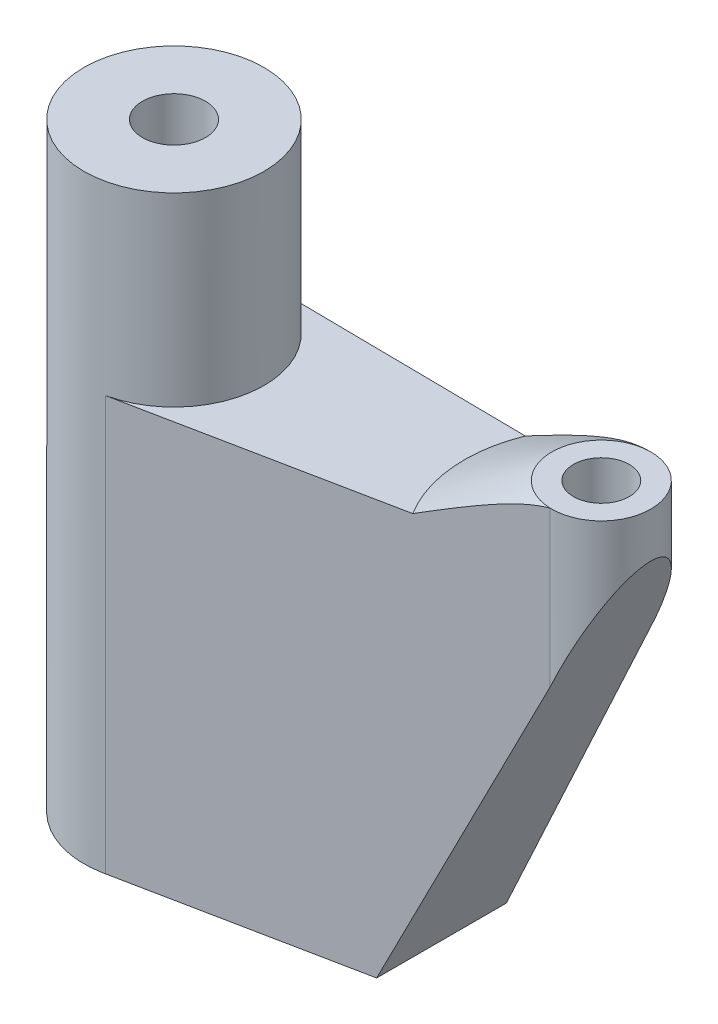
ISO-10303-21;
HEADER;
FILE_DESCRIPTION(('STEP AP214'),'2;1');
FILE_NAME('part.step','',(''),(''),'','','');
FILE_SCHEMA(('AUTOMOTIVE_DESIGN { 1 0 10303 214 1 1 1 1 }'));
ENDSEC;
DATA;
#1=APPLICATION_CONTEXT('core data for automotive mechanical design processes');
#2=APPLICATION_PROTOCOL_DEFINITION('international standard','automotive_design',2000,#1);
#3=PRODUCT_CONTEXT('',#1,'mechanical');
#4=PRODUCT('Part','Part','',(#3));
#5=PRODUCT_RELATED_PRODUCT_CATEGORY('part','',(#4));
#6=PRODUCT_DEFINITION_FORMATION('','',#4);
#7=PRODUCT_DEFINITION_CONTEXT('part definition',#1,'design');
#8=PRODUCT_DEFINITION('design','',#6,#7);
#9=PRODUCT_DEFINITION_SHAPE('','',#8);
#10=(LENGTH_UNIT() NAMED_UNIT(*) SI_UNIT(.MILLI.,.METRE.));
#11=(NAMED_UNIT(*) PLANE_ANGLE_UNIT() SI_UNIT($,.RADIAN.));
#12=(NAMED_UNIT(*) SI_UNIT($,.STERADIAN.) SOLID_ANGLE_UNIT());
#13=UNCERTAINTY_MEASURE_WITH_UNIT(LENGTH_MEASURE(1.E-05),#10,'distance_accuracy_value','');
#14=(GEOMETRIC_REPRESENTATION_CONTEXT(3) GLOBAL_UNCERTAINTY_ASSIGNED_CONTEXT((#13)) GLOBAL_UNIT_ASSIGNED_CONTEXT((#10,
#11,#12)) REPRESENTATION_CONTEXT('',''));
#15=CARTESIAN_POINT('',(0.,0.,0.));
#16=DIRECTION('',(0.,0.,1.));
#17=DIRECTION('',(1.,0.,0.));
#18=AXIS2_PLACEMENT_3D('',#15,#16,#17);
#19=CARTESIAN_POINT('',(0.,0.,0.));
#20=DIRECTION('',(0.,1.,0.));
#21=DIRECTION('',(0.,0.,1.));
#22=AXIS2_PLACEMENT_3D('',#19,#20,#21);
#23=PLANE('',#22);
#24=DIRECTION('',(0.999932354565805,0.,0.0116312635808046));
#25=VECTOR('',#24,1.);
#26=CARTESIAN_POINT('',(21.6378168834572,0.,-4.74845452445996));
#27=LINE('',#26,#25);
#28=CARTESIAN_POINT('',(0.101915459285161,0.,-4.99896121600865));
#29=VERTEX_POINT('',#28);
#30=CARTESIAN_POINT('',(13.6150315649885,0.,-4.84177596792084));
#31=VERTEX_POINT('',#30);
#32=EDGE_CURVE('E160',#29,#31,#27,.T.);
#33=ORIENTED_EDGE('',*,*,#32,.T.);
#34=DIRECTION('',(0.,0.,1.));
#35=VECTOR('',#34,1.);
#36=CARTESIAN_POINT('',(13.6150315649885,0.,0.));
#37=LINE('',#36,#35);
#38=CARTESIAN_POINT('',(13.6150315649885,0.,2.36158122583261));
#39=VERTEX_POINT('',#38);
#40=EDGE_CURVE('E241',#31,#39,#37,.T.);
#41=ORIENTED_EDGE('',*,*,#40,.T.);
#42=DIRECTION('',(-0.980378773363854,0.,0.197122958423379));
#43=VECTOR('',#42,1.);
#44=CARTESIAN_POINT('',(21.6378168834572,0.,0.748454524459963));
#45=LINE('',#44,#43);
#46=CARTESIAN_POINT('',(1.07949394707919,0.,4.88207873945304));
#47=VERTEX_POINT('',#46);
#48=EDGE_CURVE('E116',#39,#47,#45,.T.);
#49=ORIENTED_EDGE('',*,*,#48,.T.);
#50=CARTESIAN_POINT('',(0.,0.,0.));
#51=DIRECTION('',(0.,1.,0.));
#52=DIRECTION('',(0.178274539385162,0.,0.983980786706229));
#53=AXIS2_PLACEMENT_3D('',#50,#51,#52);
#54=CIRCLE('',#53,5.);
#55=CARTESIAN_POINT('',(0.891372696925809,0.,4.91990393353114));
#56=VERTEX_POINT('',#55);
#57=EDGE_CURVE('E138',#56,#47,#54,.T.);
#58=ORIENTED_EDGE('',*,*,#57,.F.);
#59=CARTESIAN_POINT('',(0.,0.,0.));
#60=DIRECTION('',(0.,1.,0.));
#61=DIRECTION('',(0.,0.,1.));
#62=AXIS2_PLACEMENT_3D('',#59,#60,#61);
#63=CIRCLE('',#62,5.);
#64=CARTESIAN_POINT('',(0.0143927209272228,0.,-4.99997928491552));
#65=VERTEX_POINT('',#64);
#66=EDGE_CURVE('E219',#65,#56,#63,.T.);
#67=ORIENTED_EDGE('',*,*,#66,.F.);
#68=CARTESIAN_POINT('',(0.,0.,0.));
#69=DIRECTION('',(0.,1.,0.));
#70=DIRECTION('',(0.020383091857032,0.,-0.99979224320173));
#71=AXIS2_PLACEMENT_3D('',#68,#69,#70);
#72=CIRCLE('',#71,5.);
#73=EDGE_CURVE('E111',#29,#65,#72,.T.);
#74=ORIENTED_EDGE('',*,*,#73,.F.);
#75=EDGE_LOOP('',(#33,#41,#49,#58,#67,#74));
#76=FACE_BOUND('',#75,.T.);
#77=CARTESIAN_POINT('',(0.,0.,0.));
#78=DIRECTION('',(0.,1.,0.));
#79=DIRECTION('',(0.,0.,1.));
#80=AXIS2_PLACEMENT_3D('',#77,#78,#79);
#81=CIRCLE('',#80,1.75);
#82=CARTESIAN_POINT('',(0.,0.,1.75));
#83=VERTEX_POINT('',#82);
#84=EDGE_CURVE('E124',#83,#83,#81,.T.);
#85=ORIENTED_EDGE('',*,*,#84,.T.);
#86=EDGE_LOOP('',(#85));
#87=FACE_BOUND('',#86,.T.);
#88=ADVANCED_FACE('F39',(#76,#87),#23,.F.);
#89=CARTESIAN_POINT('',(0.,33.3,0.));
#90=DIRECTION('',(0.,1.,0.));
#91=DIRECTION('',(0.,0.,1.));
#92=AXIS2_PLACEMENT_3D('',#89,#90,#91);
#93=PLANE('',#92);
#94=CARTESIAN_POINT('',(0.,33.3,0.));
#95=DIRECTION('',(0.,1.,0.));
#96=DIRECTION('',(0.,0.,1.));
#97=AXIS2_PLACEMENT_3D('',#94,#95,#96);
#98=CIRCLE('',#97,5.);
#99=CARTESIAN_POINT('',(0.,33.3,5.));
#100=VERTEX_POINT('',#99);
#101=EDGE_CURVE('E144',#100,#100,#98,.T.);
#102=ORIENTED_EDGE('',*,*,#101,.T.);
#103=EDGE_LOOP('',(#102));
#104=FACE_BOUND('',#103,.T.);
#105=CARTESIAN_POINT('',(0.,33.3,0.));
#106=DIRECTION('',(0.,1.,0.));
#107=DIRECTION('',(0.,0.,1.));
#108=AXIS2_PLACEMENT_3D('',#105,#106,#107);
#109=CIRCLE('',#108,1.75);
#110=CARTESIAN_POINT('',(0.,33.3,1.75));
#111=VERTEX_POINT('',#110);
#112=EDGE_CURVE('E248',#111,#111,#109,.T.);
#113=ORIENTED_EDGE('',*,*,#112,.F.);
#114=EDGE_LOOP('',(#113));
#115=FACE_BOUND('',#114,.T.);
#116=ADVANCED_FACE('F182',(#104,#115),#93,.T.);
#117=CARTESIAN_POINT('',(0.,33.3,0.));
#118=DIRECTION('',(0.,-1.,0.));
#119=DIRECTION('',(0.,0.,-1.));
#120=AXIS2_PLACEMENT_3D('',#117,#118,#119);
#121=CYLINDRICAL_SURFACE('',#120,5.);
#122=CARTESIAN_POINT('',(0.,23.,0.));
#123=DIRECTION('',(0.,1.,0.));
#124=DIRECTION('',(0.,0.,1.));
#125=AXIS2_PLACEMENT_3D('',#122,#123,#124);
#126=CIRCLE('',#125,5.);
#127=CARTESIAN_POINT('',(1.07949394707918,23.,4.88207873945304));
#128=VERTEX_POINT('',#127);
#129=CARTESIAN_POINT('',(0.101915459285161,23.,-4.99896121600865));
#130=VERTEX_POINT('',#129);
#131=EDGE_CURVE('E142',#128,#130,#126,.T.);
#132=ORIENTED_EDGE('',*,*,#131,.T.);
#133=DIRECTION('',(0.,-1.,0.));
#134=VECTOR('',#133,1.);
#135=CARTESIAN_POINT('',(0.101915459285238,33.3,-4.99896121600865));
#136=LINE('',#135,#134);
#137=EDGE_CURVE('E135',#130,#29,#136,.T.);
#138=ORIENTED_EDGE('',*,*,#137,.T.);
#139=ORIENTED_EDGE('',*,*,#73,.T.);
#140=ORIENTED_EDGE('',*,*,#66,.T.);
#141=ORIENTED_EDGE('',*,*,#57,.T.);
#142=DIRECTION('',(0.,-1.,0.));
#143=VECTOR('',#142,1.);
#144=CARTESIAN_POINT('',(1.07949394707924,33.3,4.88207873945303));
#145=LINE('',#144,#143);
#146=EDGE_CURVE('E139',#47,#128,#145,.F.);
#147=ORIENTED_EDGE('',*,*,#146,.T.);
#148=EDGE_LOOP('',(#132,#138,#139,#140,#141,#147));
#149=FACE_BOUND('',#148,.T.);
#150=ORIENTED_EDGE('',*,*,#101,.F.);
#151=EDGE_LOOP('',(#150));
#152=FACE_BOUND('',#151,.T.);
#153=ADVANCED_FACE('F180',(#149,#152),#121,.T.);
#154=CARTESIAN_POINT('',(0.,33.3,0.));
#155=DIRECTION('',(0.,-1.,0.));
#156=DIRECTION('',(0.,0.,-1.));
#157=AXIS2_PLACEMENT_3D('',#154,#155,#156);
#158=CYLINDRICAL_SURFACE('',#157,1.75);
#159=ORIENTED_EDGE('',*,*,#112,.T.);
#160=EDGE_LOOP('',(#159));
#161=FACE_BOUND('',#160,.T.);
#162=ORIENTED_EDGE('',*,*,#84,.F.);
#163=EDGE_LOOP('',(#162));
#164=FACE_BOUND('',#163,.T.);
#165=ADVANCED_FACE('F171',(#161,#164),#158,.F.);
#166=CARTESIAN_POINT('',(21.6378168834572,23.,-4.74845452445996));
#167=DIRECTION('',(0.0116312635808046,0.,-0.999932354565804));
#168=DIRECTION('',(-0.999932354565805,0.,-0.0116312635808046));
#169=AXIS2_PLACEMENT_3D('',#166,#167,#168);
#170=PLANE('',#169);
#171=DIRECTION('',(0.422613155286226,0.90629683620969,0.00491585753716713));
#172=VECTOR('',#171,1.);
#173=CARTESIAN_POINT('',(23.8574081819732,21.964847537589,-4.72263612652852));
#174=LINE('',#173,#172);
#175=CARTESIAN_POINT('',(21.6378168834572,17.2049186372185,-4.74845452445996));
#176=VERTEX_POINT('',#175);
#177=EDGE_CURVE('E109',#31,#176,#174,.T.);
#178=ORIENTED_EDGE('',*,*,#177,.F.);
#179=ORIENTED_EDGE('',*,*,#32,.F.);
#180=ORIENTED_EDGE('',*,*,#137,.F.);
#181=DIRECTION('',(0.999932354565805,0.,0.0116312635808046));
#182=VECTOR('',#181,1.);
#183=CARTESIAN_POINT('',(21.6378168834572,23.,-4.74845452445996));
#184=LINE('',#183,#182);
#185=CARTESIAN_POINT('',(14.6766021532962,23.,-4.82942772529637));
#186=VERTEX_POINT('',#185);
#187=EDGE_CURVE('E122',#130,#186,#184,.T.);
#188=ORIENTED_EDGE('',*,*,#187,.T.);
#189=CARTESIAN_POINT('',(14.6766021532962,23.,-4.82942772529637));
#190=CARTESIAN_POINT('',(14.8796626698256,23.1092941178577,-4.82706571512656));
#191=CARTESIAN_POINT('',(15.0829635424872,23.2181464252805,-4.8247009091221));
#192=CARTESIAN_POINT('',(15.4902340555521,23.4346386005559,-4.81996351797307));
#193=CARTESIAN_POINT('',(15.6942037576039,23.5422783523416,-4.81759093211141));
#194=CARTESIAN_POINT('',(16.1036749014754,23.7563687196145,-4.81282794311385));
#195=CARTESIAN_POINT('',(16.3091792047588,23.8628138728167,-4.81043750669326));
#196=CARTESIAN_POINT('',(16.7212525461933,24.0736002972985,-4.8056442488024));
#197=CARTESIAN_POINT('',(16.9278215277995,24.1779416788922,-4.80324142798986));
#198=CARTESIAN_POINT('',(17.3376459041992,24.3814130630635,-4.79847433017372));
#199=CARTESIAN_POINT('',(17.5408690963755,24.480607671266,-4.79611042775258));
#200=CARTESIAN_POINT('',(17.9491239391777,24.6751849384902,-4.7913615868304));
#201=CARTESIAN_POINT('',(18.1541554850912,24.7705678164839,-4.78897664954738));
#202=CARTESIAN_POINT('',(18.5665029122763,24.955805858541,-4.78418020347724));
#203=CARTESIAN_POINT('',(18.7738164815264,25.0456661014631,-4.78176872158368));
#204=CARTESIAN_POINT('',(19.0872597302892,25.1743670145884,-4.77812273390527));
#205=CARTESIAN_POINT('',(19.1921400639008,25.2162476897179,-4.77690276057497));
#206=CARTESIAN_POINT('',(19.4028651374469,25.2975003427465,-4.77445159589137));
#207=CARTESIAN_POINT('',(19.5087098034331,25.3368725111864,-4.77322040539825));
#208=CARTESIAN_POINT('',(19.6962421242857,25.4035469087023,-4.77103901998373));
#209=CARTESIAN_POINT('',(19.777699608178,25.4314956328406,-4.77009150242271));
#210=CARTESIAN_POINT('',(19.9413120433655,25.4852809285915,-4.76818835432467));
#211=CARTESIAN_POINT('',(20.0234669932341,25.5111175045231,-4.76723272380424));
#212=CARTESIAN_POINT('',(20.1884133671109,25.5602861589062,-4.76531405926408));
#213=CARTESIAN_POINT('',(20.2712038529606,25.5836213686864,-4.76435103615707));
#214=CARTESIAN_POINT('',(20.4375486183177,25.6274202653575,-4.76241610545668));
#215=CARTESIAN_POINT('',(20.5211029231418,25.6478838566983,-4.76144419756883));
#216=CARTESIAN_POINT('',(20.68964824343,25.6856553270922,-4.75948366990251));
#217=CARTESIAN_POINT('',(20.7746454223341,25.7029359211913,-4.75849497843058));
#218=CARTESIAN_POINT('',(20.9453202419842,25.7336786011953,-4.75650968032027));
#219=CARTESIAN_POINT('',(21.0309977786458,25.7471412600418,-4.7555130748926));
#220=CARTESIAN_POINT('',(21.2033086153485,25.7698783355715,-4.75350874654942));
#221=CARTESIAN_POINT('',(21.2899444858131,25.7791335273032,-4.75250099373462));
#222=CARTESIAN_POINT('',(21.4636328266449,25.7930737488483,-4.75048064219393));
#223=CARTESIAN_POINT('',(21.5506855153192,25.7977560400299,-4.74946804092869));
#224=CARTESIAN_POINT('',(21.6378168834572,25.8,-4.74845452445996));
#225=B_SPLINE_CURVE_WITH_KNOTS('',3,(#189,#190,#191,#192,#193,#194,#195,#196,#197,#198,#199,
#200,#201,#202,#203,#204,#205,#206,#207,#208,#209,#210,#211,#212,#213,#214,#215,#216,#217,#218,
#219,#220,#221,#222,#223,#224),.UNSPECIFIED.,.F.,.F.,(4,2,2,2,2,2,2,2,2,2,2,2,2,2,2,2,2,4),(0.,
0.691854884624876,1.38377544090352,2.07811120512196,2.77241046571636,3.45083776481357,
4.12922603421089,4.80698079272842,5.14577582069325,5.48454508372705,5.74289349267163,
6.00124137332267,6.25926196897584,6.51729114795656,6.77743854151787,7.03754687517051,
7.29883204812334,7.56027360451283),.UNSPECIFIED.);
#226=CARTESIAN_POINT('',(21.6378168834572,25.8,-4.74845452445996));
#227=VERTEX_POINT('',#226);
#228=EDGE_CURVE('E54',#186,#227,#225,.T.);
#229=ORIENTED_EDGE('',*,*,#228,.T.);
#230=DIRECTION('',(0.,-1.,0.));
#231=VECTOR('',#230,1.);
#232=CARTESIAN_POINT('',(21.6378168834572,23.,-4.74845452445996));
#233=LINE('',#232,#231);
#234=EDGE_CURVE('E67',#227,#176,#233,.T.);
#235=ORIENTED_EDGE('',*,*,#234,.T.);
#236=EDGE_LOOP('',(#178,#179,#180,#188,#229,#235));
#237=FACE_BOUND('',#236,.T.);
#238=ADVANCED_FACE('F167',(#237),#170,.T.);
#239=CARTESIAN_POINT('',(21.6378168834572,23.,0.748454524459963));
#240=DIRECTION('',(0.197122958423379,0.,0.980378773363854));
#241=DIRECTION('',(0.980378773363854,0.,-0.197122958423379));
#242=AXIS2_PLACEMENT_3D('',#239,#240,#241);
#243=PLANE('',#242);
#244=DIRECTION('',(-0.421100662169674,-0.903053284254022,0.0846699363309477));
#245=VECTOR('',#244,1.);
#246=CARTESIAN_POINT('',(23.8415491907662,21.9308378211931,0.305354118991775));
#247=LINE('',#246,#245);
#248=CARTESIAN_POINT('',(21.6378168834572,17.2049186372185,0.748454524459963));
#249=VERTEX_POINT('',#248);
#250=EDGE_CURVE('E106',#249,#39,#247,.T.);
#251=ORIENTED_EDGE('',*,*,#250,.F.);
#252=DIRECTION('',(0.,-1.,0.));
#253=VECTOR('',#252,1.);
#254=CARTESIAN_POINT('',(21.6378168834572,23.,0.748454524459963));
#255=LINE('',#254,#253);
#256=CARTESIAN_POINT('',(21.6378168834572,25.8,0.748454524459963));
#257=VERTEX_POINT('',#256);
#258=EDGE_CURVE('E60',#257,#249,#255,.T.);
#259=ORIENTED_EDGE('',*,*,#258,.F.);
#260=CARTESIAN_POINT('',(21.6378168834572,25.8,0.748454524459963));
#261=CARTESIAN_POINT('',(21.5397797210632,25.7867443844635,0.768166676550135));
#262=CARTESIAN_POINT('',(21.4421740232941,25.7705317543355,0.787792074841057));
#263=CARTESIAN_POINT('',(21.2479987260539,25.7329602324525,0.826834545042029));
#264=CARTESIAN_POINT('',(21.1514283187012,25.7116057131708,0.846251779391363));
#265=CARTESIAN_POINT('',(20.8639861294159,25.6411097489942,0.904047252189283));
#266=CARTESIAN_POINT('',(20.674663287674,25.5854275478558,0.942114048080061));
#267=CARTESIAN_POINT('',(20.3009492566295,25.4623422745753,1.017256041568));
#268=CARTESIAN_POINT('',(20.1165375033442,25.395001817336,1.05433537392738));
#269=CARTESIAN_POINT('',(19.7505927448082,25.2521104231172,1.12791521406879));
#270=CARTESIAN_POINT('',(19.5690632522126,25.1765502351496,1.16441501556771));
#271=CARTESIAN_POINT('',(19.2135116492468,25.0220363942388,1.235905123017));
#272=CARTESIAN_POINT('',(19.0394229038302,24.9432404972671,1.27090882715371));
#273=CARTESIAN_POINT('',(18.6929384468855,24.7818535275945,1.34057582021426));
#274=CARTESIAN_POINT('',(18.5205428559012,24.6992621870213,1.3752390849006));
#275=CARTESIAN_POINT('',(18.1770892535932,24.5313262319339,1.44429666958884));
#276=CARTESIAN_POINT('',(18.0060310061939,24.4459821176421,1.47869103705803));
#277=CARTESIAN_POINT('',(17.6649221854132,24.2732222373785,1.54727716083332));
#278=CARTESIAN_POINT('',(17.4948716282343,24.1858064382087,1.5814689138816));
#279=CARTESIAN_POINT('',(17.1538638990705,24.0085100616445,1.65003471135125));
#280=CARTESIAN_POINT('',(16.9829146951635,23.9186135696879,1.68440715364583));
#281=CARTESIAN_POINT('',(16.6416546315205,23.7375649625799,1.75302368754552));
#282=CARTESIAN_POINT('',(16.4713437800163,23.6464128313069,1.78726777749549));
#283=CARTESIAN_POINT('',(16.1313276227601,23.463168730788,1.85563420142377));
#284=CARTESIAN_POINT('',(15.961622038492,23.3710772985544,1.88975659140281));
#285=CARTESIAN_POINT('',(15.622637495103,23.1860936838876,1.95791559062652));
#286=CARTESIAN_POINT('',(15.4533585228132,23.0932015265727,1.99195220251903));
#287=CARTESIAN_POINT('',(15.2842445283578,23.,2.02595564262153));
#288=B_SPLINE_CURVE_WITH_KNOTS('',3,(#260,#261,#262,#263,#264,#265,#266,#267,#268,#269,#270,
#271,#272,#273,#274,#275,#276,#277,#278,#279,#280,#281,#282,#283,#284,#285,#286,#287),
.UNSPECIFIED.,.F.,.F.,(4,2,2,2,2,2,2,2,2,2,2,2,2,4),(0.,0.302505857853733,0.604755378731426,
1.20703648643573,1.80617786267751,2.40600066553136,2.98875435499166,3.57154923702456,
4.15423880613771,4.7369377189948,5.32547042982597,5.91401070400878,6.50223151167056,
7.09043393375271),.UNSPECIFIED.);
#289=CARTESIAN_POINT('',(15.2842445283578,23.,2.02595564262153));
#290=VERTEX_POINT('',#289);
#291=EDGE_CURVE('E11',#257,#290,#288,.T.);
#292=ORIENTED_EDGE('',*,*,#291,.T.);
#293=DIRECTION('',(-0.980378773363854,0.,0.197122958423379));
#294=VECTOR('',#293,1.);
#295=CARTESIAN_POINT('',(21.6378168834572,23.,0.748454524459963));
#296=LINE('',#295,#294);
#297=EDGE_CURVE('E127',#290,#128,#296,.T.);
#298=ORIENTED_EDGE('',*,*,#297,.T.);
#299=ORIENTED_EDGE('',*,*,#146,.F.);
#300=ORIENTED_EDGE('',*,*,#48,.F.);
#301=EDGE_LOOP('',(#251,#259,#292,#298,#299,#300));
#302=FACE_BOUND('',#301,.T.);
#303=ADVANCED_FACE('F114',(#302),#243,.T.);
#304=CARTESIAN_POINT('',(0.,23.,0.));
#305=DIRECTION('',(0.,1.,0.));
#306=DIRECTION('',(0.,0.,1.));
#307=AXIS2_PLACEMENT_3D('',#304,#305,#306);
#308=PLANE('',#307);
#309=ORIENTED_EDGE('',*,*,#297,.F.);
#310=CARTESIAN_POINT('',(21.73,23.,-2.));
#311=DIRECTION('',(0.,1.,0.));
#312=DIRECTION('',(0.,0.,1.));
#313=AXIS2_PLACEMENT_3D('',#310,#311,#312);
#314=CIRCLE('',#313,7.59974226119291);
#315=EDGE_CURVE('E110',#290,#186,#314,.F.);
#316=ORIENTED_EDGE('',*,*,#315,.T.);
#317=ORIENTED_EDGE('',*,*,#187,.F.);
#318=ORIENTED_EDGE('',*,*,#131,.F.);
#319=EDGE_LOOP('',(#309,#316,#317,#318));
#320=FACE_BOUND('',#319,.T.);
#321=ADVANCED_FACE('F173',(#320),#308,.T.);
#322=CARTESIAN_POINT('',(21.73,25.8,-2.));
#323=DIRECTION('',(0.,-1.,0.));
#324=DIRECTION('',(0.,0.,-1.));
#325=AXIS2_PLACEMENT_3D('',#322,#323,#324);
#326=CYLINDRICAL_SURFACE('',#325,2.75);
#327=ORIENTED_EDGE('',*,*,#234,.F.);
#328=CARTESIAN_POINT('',(21.73,25.8,-2.));
#329=DIRECTION('',(0.,1.,0.));
#330=DIRECTION('',(0.,0.,1.));
#331=AXIS2_PLACEMENT_3D('',#328,#329,#330);
#332=CIRCLE('',#331,2.75);
#333=EDGE_CURVE('E120',#257,#227,#332,.T.);
#334=ORIENTED_EDGE('',*,*,#333,.F.);
#335=ORIENTED_EDGE('',*,*,#258,.T.);
#336=CARTESIAN_POINT('',(21.73,17.4026059685987,-2.));
#337=DIRECTION('',(-0.906307787036649,0.4226182617407,0.));
#338=DIRECTION('',(-0.4226182617407,-0.90630778703665,0.));
#339=AXIS2_PLACEMENT_3D('',#336,#337,#338);
#340=ELLIPSE('',#339,6.50705435366936,2.75);
#341=EDGE_CURVE('E104',#249,#176,#340,.T.);
#342=ORIENTED_EDGE('',*,*,#341,.T.);
#343=EDGE_LOOP('',(#327,#334,#335,#342));
#344=FACE_BOUND('',#343,.T.);
#345=ADVANCED_FACE('F118',(#344),#326,.T.);
#346=CARTESIAN_POINT('',(21.73,25.8,-2.));
#347=DIRECTION('',(0.,1.,0.));
#348=DIRECTION('',(0.,0.,1.));
#349=AXIS2_PLACEMENT_3D('',#346,#347,#348);
#350=PLANE('',#349);
#351=CARTESIAN_POINT('',(21.73,25.8,-2.));
#352=DIRECTION('',(0.,1.,0.));
#353=DIRECTION('',(0.,0.,1.));
#354=AXIS2_PLACEMENT_3D('',#351,#352,#353);
#355=CIRCLE('',#354,1.55);
#356=CARTESIAN_POINT('',(21.73,25.8,-0.450000000000003));
#357=VERTEX_POINT('',#356);
#358=EDGE_CURVE('E237',#357,#357,#355,.T.);
#359=ORIENTED_EDGE('',*,*,#358,.F.);
#360=EDGE_LOOP('',(#359));
#361=FACE_BOUND('',#360,.T.);
#362=EDGE_CURVE('E232',#227,#257,#332,.T.);
#363=ORIENTED_EDGE('',*,*,#362,.T.);
#364=ORIENTED_EDGE('',*,*,#333,.T.);
#365=EDGE_LOOP('',(#363,#364));
#366=FACE_BOUND('',#365,.T.);
#367=ADVANCED_FACE('F234',(#361,#366),#350,.T.);
#368=CARTESIAN_POINT('',(21.73,22.8,-2.));
#369=DIRECTION('',(0.,1.,0.));
#370=DIRECTION('',(0.,0.,1.));
#371=AXIS2_PLACEMENT_3D('',#368,#369,#370);
#372=CYLINDRICAL_SURFACE('',#371,1.55);
#373=CARTESIAN_POINT('',(21.73,22.8,-2.));
#374=DIRECTION('',(0.,1.,0.));
#375=DIRECTION('',(0.,0.,1.));
#376=AXIS2_PLACEMENT_3D('',#373,#374,#375);
#377=CIRCLE('',#376,1.55);
#378=CARTESIAN_POINT('',(21.73,22.8,-0.450000000000003));
#379=VERTEX_POINT('',#378);
#380=EDGE_CURVE('E235',#379,#379,#377,.T.);
#381=ORIENTED_EDGE('',*,*,#380,.F.);
#382=EDGE_LOOP('',(#381));
#383=FACE_BOUND('',#382,.T.);
#384=ORIENTED_EDGE('',*,*,#358,.T.);
#385=EDGE_LOOP('',(#384));
#386=FACE_BOUND('',#385,.T.);
#387=ADVANCED_FACE('F290',(#383,#386),#372,.F.);
#388=CARTESIAN_POINT('',(21.73,22.8,-2.));
#389=DIRECTION('',(0.,1.,0.));
#390=DIRECTION('',(0.,0.,1.));
#391=AXIS2_PLACEMENT_3D('',#388,#389,#390);
#392=PLANE('',#391);
#393=ORIENTED_EDGE('',*,*,#380,.T.);
#394=EDGE_LOOP('',(#393));
#395=FACE_BOUND('',#394,.T.);
#396=ADVANCED_FACE('F298',(#395),#392,.T.);
#397=CARTESIAN_POINT('',(24.48,23.3,-5.04896121600865));
#398=DIRECTION('',(-0.906307787036649,0.4226182617407,0.));
#399=DIRECTION('',(-0.4226182617407,-0.90630778703665,0.));
#400=AXIS2_PLACEMENT_3D('',#397,#398,#399);
#401=PLANE('',#400);
#402=ORIENTED_EDGE('',*,*,#177,.T.);
#403=ORIENTED_EDGE('',*,*,#341,.F.);
#404=ORIENTED_EDGE('',*,*,#250,.T.);
#405=ORIENTED_EDGE('',*,*,#40,.F.);
#406=EDGE_LOOP('',(#402,#403,#404,#405));
#407=FACE_BOUND('',#406,.T.);
#408=ADVANCED_FACE('F105',(#407),#401,.F.);
#409=CARTESIAN_POINT('',(21.73,23.,-2.));
#410=DIRECTION('',(0.,-1.,0.));
#411=DIRECTION('',(0.,0.,-1.));
#412=AXIS2_PLACEMENT_3D('',#409,#410,#411);
#413=CONICAL_SURFACE('',#412,7.59974226119291,1.0471975511966);
#414=ORIENTED_EDGE('',*,*,#291,.F.);
#415=ORIENTED_EDGE('',*,*,#362,.F.);
#416=ORIENTED_EDGE('',*,*,#228,.F.);
#417=ORIENTED_EDGE('',*,*,#315,.F.);
#418=EDGE_LOOP('',(#414,#415,#416,#417));
#419=FACE_BOUND('',#418,.T.);
#420=ADVANCED_FACE('F42',(#419),#413,.T.);
#421=CLOSED_SHELL('',(#88,#116,#153,#165,#238,#303,#321,#345,#367,#387,#396,#408,#420));
#422=MANIFOLD_SOLID_BREP('B2',#421);
#423=ADVANCED_BREP_SHAPE_REPRESENTATION('',(#18,#422),#14);
#424=SHAPE_DEFINITION_REPRESENTATION(#9,#423);
ENDSEC;
END-ISO-10303-21;
